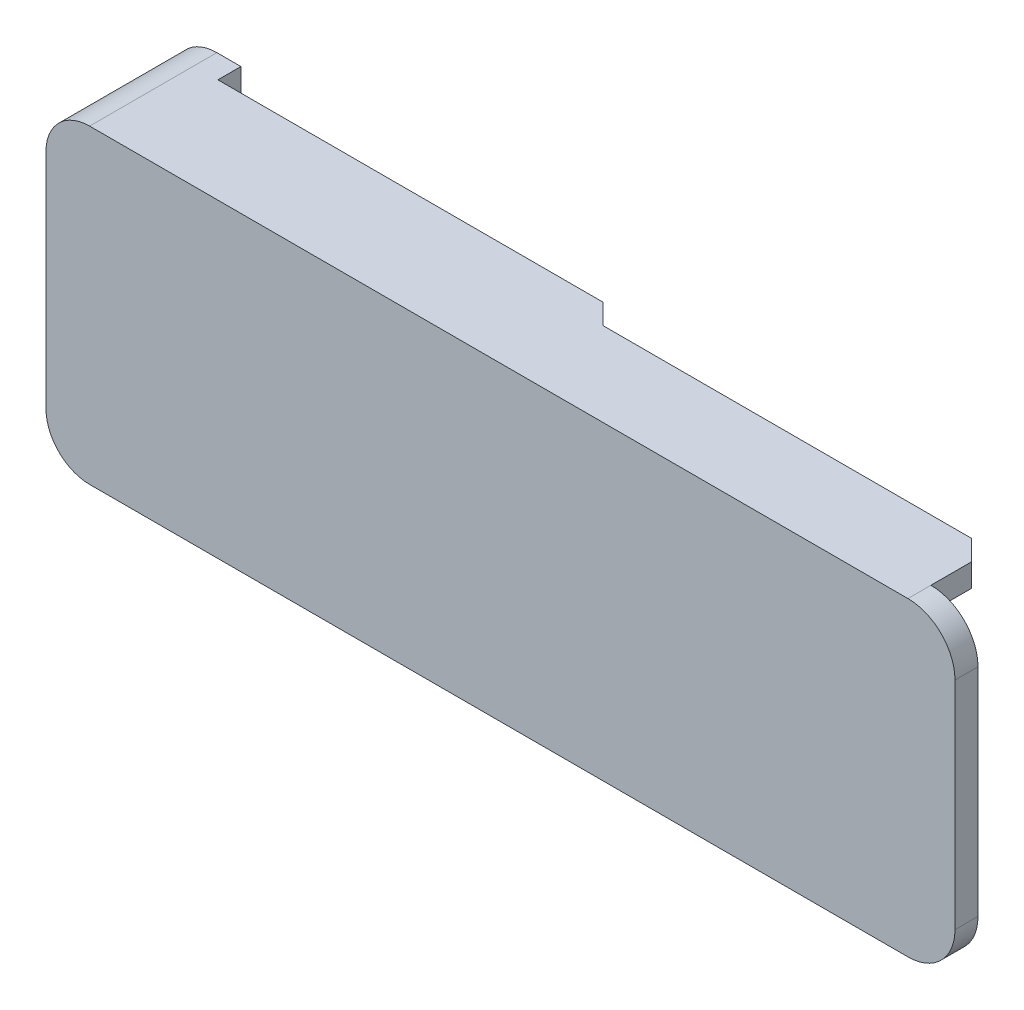
ISO-10303-21;
HEADER;
FILE_DESCRIPTION(('STEP AP214'),'2;1');
FILE_NAME('part.step','',(''),(''),'','','');
FILE_SCHEMA(('AUTOMOTIVE_DESIGN { 1 0 10303 214 1 1 1 1 }'));
ENDSEC;
DATA;
#1=APPLICATION_CONTEXT('core data for automotive mechanical design processes');
#2=APPLICATION_PROTOCOL_DEFINITION('international standard','automotive_design',2000,#1);
#3=PRODUCT_CONTEXT('',#1,'mechanical');
#4=PRODUCT('Part','Part','',(#3));
#5=PRODUCT_RELATED_PRODUCT_CATEGORY('part','',(#4));
#6=PRODUCT_DEFINITION_FORMATION('','',#4);
#7=PRODUCT_DEFINITION_CONTEXT('part definition',#1,'design');
#8=PRODUCT_DEFINITION('design','',#6,#7);
#9=PRODUCT_DEFINITION_SHAPE('','',#8);
#10=(LENGTH_UNIT() NAMED_UNIT(*) SI_UNIT(.MILLI.,.METRE.));
#11=(NAMED_UNIT(*) PLANE_ANGLE_UNIT() SI_UNIT($,.RADIAN.));
#12=(NAMED_UNIT(*) SI_UNIT($,.STERADIAN.) SOLID_ANGLE_UNIT());
#13=UNCERTAINTY_MEASURE_WITH_UNIT(LENGTH_MEASURE(1.E-05),#10,'distance_accuracy_value','');
#14=(GEOMETRIC_REPRESENTATION_CONTEXT(3) GLOBAL_UNCERTAINTY_ASSIGNED_CONTEXT((#13)) GLOBAL_UNIT_ASSIGNED_CONTEXT((#10,
#11,#12)) REPRESENTATION_CONTEXT('',''));
#15=CARTESIAN_POINT('',(0.,0.,0.));
#16=DIRECTION('',(0.,0.,1.));
#17=DIRECTION('',(1.,0.,0.));
#18=AXIS2_PLACEMENT_3D('',#15,#16,#17);
#19=CARTESIAN_POINT('',(-65.4990840744991,47.1076347781375,-6.));
#20=DIRECTION('',(0.,0.,1.));
#21=DIRECTION('',(1.,0.,0.));
#22=AXIS2_PLACEMENT_3D('',#19,#20,#21);
#23=PLANE('',#22);
#24=DIRECTION('',(0.,-1.,0.));
#25=VECTOR('',#24,1.);
#26=CARTESIAN_POINT('',(-63.7231673870083,27.4037181080197,-6.));
#27=LINE('',#26,#25);
#28=CARTESIAN_POINT('',(-63.7231673870083,50.3317180906467,-6.));
#29=VERTEX_POINT('',#28);
#30=CARTESIAN_POINT('',(-63.7231673870083,48.6317180906467,-6.));
#31=VERTEX_POINT('',#30);
#32=EDGE_CURVE('E222',#29,#31,#27,.T.);
#33=ORIENTED_EDGE('',*,*,#32,.F.);
#34=DIRECTION('',(-1.,0.,0.));
#35=VECTOR('',#34,1.);
#36=CARTESIAN_POINT('',(-5.04716840515152,50.3317180906467,-6.));
#37=LINE('',#36,#35);
#38=CARTESIAN_POINT('',(-35.2731262398253,50.3317180906467,-6.));
#39=VERTEX_POINT('',#38);
#40=EDGE_CURVE('E375',#39,#29,#37,.T.);
#41=ORIENTED_EDGE('',*,*,#40,.F.);
#42=DIRECTION('',(0.,1.,0.));
#43=VECTOR('',#42,1.);
#44=CARTESIAN_POINT('',(-35.2731262398253,21.3317180906467,-6.));
#45=LINE('',#44,#43);
#46=CARTESIAN_POINT('',(-35.2731262398253,48.6317180906467,-6.));
#47=VERTEX_POINT('',#46);
#48=EDGE_CURVE('E261',#47,#39,#45,.T.);
#49=ORIENTED_EDGE('',*,*,#48,.F.);
#50=DIRECTION('',(-1.,0.,0.));
#51=VECTOR('',#50,1.);
#52=CARTESIAN_POINT('',(-5.04716840515152,48.6317180906467,-6.));
#53=LINE('',#52,#51);
#54=EDGE_CURVE('E332',#47,#31,#53,.T.);
#55=ORIENTED_EDGE('',*,*,#54,.T.);
#56=EDGE_LOOP('',(#33,#41,#49,#55));
#57=FACE_BOUND('',#56,.T.);
#58=ADVANCED_FACE('F33',(#57),#23,.F.);
#59=CARTESIAN_POINT('',(-63.7231673870083,29.1037181080198,-6.));
#60=VERTEX_POINT('',#59);
#61=CARTESIAN_POINT('',(-63.7231673870083,27.4037181080197,-6.));
#62=VERTEX_POINT('',#61);
#63=EDGE_CURVE('E48',#60,#62,#27,.T.);
#64=ORIENTED_EDGE('',*,*,#63,.F.);
#65=DIRECTION('',(1.,0.,0.));
#66=VECTOR('',#65,1.);
#67=CARTESIAN_POINT('',(-14.8291687568263,29.1037181080198,-6.));
#68=LINE('',#67,#66);
#69=CARTESIAN_POINT('',(-35.2731262398253,29.1037181080198,-6.));
#70=VERTEX_POINT('',#69);
#71=EDGE_CURVE('E343',#60,#70,#68,.T.);
#72=ORIENTED_EDGE('',*,*,#71,.T.);
#73=CARTESIAN_POINT('',(-35.2731262398253,27.4037181080197,-6.));
#74=VERTEX_POINT('',#73);
#75=EDGE_CURVE('E278',#74,#70,#45,.T.);
#76=ORIENTED_EDGE('',*,*,#75,.F.);
#77=DIRECTION('',(1.,0.,0.));
#78=VECTOR('',#77,1.);
#79=CARTESIAN_POINT('',(-14.8291687568263,27.4037181080198,-6.));
#80=LINE('',#79,#78);
#81=EDGE_CURVE('E365',#62,#74,#80,.T.);
#82=ORIENTED_EDGE('',*,*,#81,.F.);
#83=EDGE_LOOP('',(#64,#72,#76,#82));
#84=FACE_BOUND('',#83,.T.);
#85=ADVANCED_FACE('F417',(#84),#23,.F.);
#86=CARTESIAN_POINT('',(-65.4990840744991,47.1076347781375,-6.));
#87=DIRECTION('',(0.,0.,1.));
#88=DIRECTION('',(1.,0.,0.));
#89=AXIS2_PLACEMENT_3D('',#86,#87,#88);
#90=CYLINDRICAL_SURFACE('',#89,3.22408331250919);
#91=DIRECTION('',(0.,0.,1.));
#92=VECTOR('',#91,1.);
#93=CARTESIAN_POINT('',(-68.7231673870083,47.1076347781375,-6.));
#94=LINE('',#93,#92);
#95=CARTESIAN_POINT('',(-68.7231673870083,47.1076347781375,-7.7));
#96=VERTEX_POINT('',#95);
#97=CARTESIAN_POINT('',(-68.7231673870083,47.1076347781375,1.7));
#98=VERTEX_POINT('',#97);
#99=EDGE_CURVE('E378',#96,#98,#94,.T.);
#100=ORIENTED_EDGE('',*,*,#99,.T.);
#101=CARTESIAN_POINT('',(-65.4990840744991,47.1076347781375,1.7));
#102=DIRECTION('',(0.,0.,1.));
#103=DIRECTION('',(1.,0.,0.));
#104=AXIS2_PLACEMENT_3D('',#101,#102,#103);
#105=CIRCLE('',#104,3.22408331250919);
#106=CARTESIAN_POINT('',(-65.4990840744991,50.3317180906467,1.7));
#107=VERTEX_POINT('',#106);
#108=EDGE_CURVE('E325',#107,#98,#105,.T.);
#109=ORIENTED_EDGE('',*,*,#108,.F.);
#110=DIRECTION('',(0.,0.,1.));
#111=VECTOR('',#110,1.);
#112=CARTESIAN_POINT('',(-65.4990840744991,50.3317180906467,-6.));
#113=LINE('',#112,#111);
#114=CARTESIAN_POINT('',(-65.4990840744991,50.3317180906467,-7.7));
#115=VERTEX_POINT('',#114);
#116=EDGE_CURVE('E379',#115,#107,#113,.T.);
#117=ORIENTED_EDGE('',*,*,#116,.F.);
#118=CARTESIAN_POINT('',(-65.4990840744991,47.1076347781375,-7.7));
#119=DIRECTION('',(0.,0.,-1.));
#120=DIRECTION('',(-1.,0.,0.));
#121=AXIS2_PLACEMENT_3D('',#118,#119,#120);
#122=CIRCLE('',#121,3.22408331250919);
#123=EDGE_CURVE('E232',#96,#115,#122,.T.);
#124=ORIENTED_EDGE('',*,*,#123,.F.);
#125=EDGE_LOOP('',(#100,#109,#117,#124));
#126=FACE_BOUND('',#125,.T.);
#127=ADVANCED_FACE('F35',(#126),#90,.T.);
#128=CARTESIAN_POINT('',(-65.4990840744991,50.3317180906467,-6.));
#129=DIRECTION('',(0.,1.,0.));
#130=DIRECTION('',(0.,0.,1.));
#131=AXIS2_PLACEMENT_3D('',#128,#129,#130);
#132=PLANE('',#131);
#133=DIRECTION('',(0.707106781186547,0.,0.707106781186548));
#134=VECTOR('',#133,1.);
#135=CARTESIAN_POINT('',(-6.54716840515152,50.3317180906467,-4.5));
#136=LINE('',#135,#134);
#137=CARTESIAN_POINT('',(-6.54716840515152,50.3317180906467,-4.5));
#138=VERTEX_POINT('',#137);
#139=CARTESIAN_POINT('',(-5.04716840515152,50.3317180906467,-3.));
#140=VERTEX_POINT('',#139);
#141=EDGE_CURVE('E255',#138,#140,#136,.T.);
#142=ORIENTED_EDGE('',*,*,#141,.F.);
#143=DIRECTION('',(1.,0.,0.));
#144=VECTOR('',#143,1.);
#145=CARTESIAN_POINT('',(-33.7731262398253,50.3317180906467,-4.5));
#146=LINE('',#145,#144);
#147=CARTESIAN_POINT('',(-33.7731262398253,50.3317180906467,-4.5));
#148=VERTEX_POINT('',#147);
#149=EDGE_CURVE('E252',#148,#138,#146,.T.);
#150=ORIENTED_EDGE('',*,*,#149,.F.);
#151=DIRECTION('',(0.707106781186546,0.,0.707106781186549));
#152=VECTOR('',#151,1.);
#153=CARTESIAN_POINT('',(-35.2731262398253,50.3317180906467,-6.));
#154=LINE('',#153,#152);
#155=EDGE_CURVE('E249',#39,#148,#154,.T.);
#156=ORIENTED_EDGE('',*,*,#155,.F.);
#157=ORIENTED_EDGE('',*,*,#40,.T.);
#158=DIRECTION('',(0.,0.,1.));
#159=VECTOR('',#158,1.);
#160=CARTESIAN_POINT('',(-63.7231673870083,50.3317180906467,-7.7));
#161=LINE('',#160,#159);
#162=CARTESIAN_POINT('',(-63.7231673870083,50.3317180906467,-7.7));
#163=VERTEX_POINT('',#162);
#164=EDGE_CURVE('E240',#163,#29,#161,.T.);
#165=ORIENTED_EDGE('',*,*,#164,.F.);
#166=DIRECTION('',(1.,0.,0.));
#167=VECTOR('',#166,1.);
#168=CARTESIAN_POINT('',(-65.4990840744991,50.3317180906467,-7.7));
#169=LINE('',#168,#167);
#170=EDGE_CURVE('E235',#115,#163,#169,.T.);
#171=ORIENTED_EDGE('',*,*,#170,.F.);
#172=ORIENTED_EDGE('',*,*,#116,.T.);
#173=DIRECTION('',(-1.,0.,0.));
#174=VECTOR('',#173,1.);
#175=CARTESIAN_POINT('',(-5.04716840515152,50.3317180906467,1.7));
#176=LINE('',#175,#174);
#177=CARTESIAN_POINT('',(-5.04716840515152,50.3317180906467,1.7));
#178=VERTEX_POINT('',#177);
#179=EDGE_CURVE('E322',#178,#107,#176,.T.);
#180=ORIENTED_EDGE('',*,*,#179,.F.);
#181=DIRECTION('',(0.,0.,1.));
#182=VECTOR('',#181,1.);
#183=CARTESIAN_POINT('',(-5.04716840515152,50.3317180906467,-6.));
#184=LINE('',#183,#182);
#185=CARTESIAN_POINT('',(-5.04716840515152,50.3317180906467,0.));
#186=VERTEX_POINT('',#185);
#187=EDGE_CURVE('E382',#186,#178,#184,.T.);
#188=ORIENTED_EDGE('',*,*,#187,.F.);
#189=DIRECTION('',(0.,0.,1.));
#190=VECTOR('',#189,1.);
#191=CARTESIAN_POINT('',(-5.04716840515152,50.3317180906467,-3.));
#192=LINE('',#191,#190);
#193=EDGE_CURVE('E258',#140,#186,#192,.T.);
#194=ORIENTED_EDGE('',*,*,#193,.F.);
#195=EDGE_LOOP('',(#142,#150,#156,#157,#165,#171,#172,#180,#188,#194));
#196=FACE_BOUND('',#195,.T.);
#197=ADVANCED_FACE('F428',(#196),#132,.T.);
#198=CARTESIAN_POINT('',(-5.04716840515152,46.8537180906467,-6.));
#199=DIRECTION('',(0.,0.,1.));
#200=DIRECTION('',(1.,0.,0.));
#201=AXIS2_PLACEMENT_3D('',#198,#199,#200);
#202=CYLINDRICAL_SURFACE('',#201,3.478);
#203=CARTESIAN_POINT('',(-5.04716840515152,46.8537180906467,0.));
#204=DIRECTION('',(0.,0.,1.));
#205=DIRECTION('',(1.,0.,0.));
#206=AXIS2_PLACEMENT_3D('',#203,#204,#205);
#207=CIRCLE('',#206,3.478);
#208=CARTESIAN_POINT('',(-1.56916840515152,46.8537180906467,0.));
#209=VERTEX_POINT('',#208);
#210=EDGE_CURVE('E289',#186,#209,#207,.F.);
#211=ORIENTED_EDGE('',*,*,#210,.F.);
#212=ORIENTED_EDGE('',*,*,#187,.T.);
#213=CARTESIAN_POINT('',(-5.04716840515152,46.8537180906467,1.7));
#214=DIRECTION('',(0.,0.,1.));
#215=DIRECTION('',(1.,0.,0.));
#216=AXIS2_PLACEMENT_3D('',#213,#214,#215);
#217=CIRCLE('',#216,3.478);
#218=CARTESIAN_POINT('',(-1.56916840515152,46.8537180906467,1.7));
#219=VERTEX_POINT('',#218);
#220=EDGE_CURVE('E319',#219,#178,#217,.T.);
#221=ORIENTED_EDGE('',*,*,#220,.F.);
#222=DIRECTION('',(0.,0.,1.));
#223=VECTOR('',#222,1.);
#224=CARTESIAN_POINT('',(-1.56916840515152,46.8537180906467,-6.));
#225=LINE('',#224,#223);
#226=EDGE_CURVE('E384',#209,#219,#225,.T.);
#227=ORIENTED_EDGE('',*,*,#226,.F.);
#228=EDGE_LOOP('',(#211,#212,#221,#227));
#229=FACE_BOUND('',#228,.T.);
#230=ADVANCED_FACE('F484',(#229),#202,.T.);
#231=CARTESIAN_POINT('',(-1.56916840515152,43.9657183857165,-6.));
#232=DIRECTION('',(1.,0.,0.));
#233=DIRECTION('',(0.,1.,0.));
#234=AXIS2_PLACEMENT_3D('',#231,#232,#233);
#235=PLANE('',#234);
#236=DIRECTION('',(0.,1.,0.));
#237=VECTOR('',#236,1.);
#238=CARTESIAN_POINT('',(-1.56916840515152,21.3317180906467,0.));
#239=LINE('',#238,#237);
#240=CARTESIAN_POINT('',(-1.56916840515152,30.8817181080198,0.));
#241=VERTEX_POINT('',#240);
#242=EDGE_CURVE('E262',#241,#209,#239,.T.);
#243=ORIENTED_EDGE('',*,*,#242,.T.);
#244=ORIENTED_EDGE('',*,*,#226,.T.);
#245=DIRECTION('',(0.,1.,0.));
#246=VECTOR('',#245,1.);
#247=CARTESIAN_POINT('',(-1.56916840515152,30.8817181080198,1.7));
#248=LINE('',#247,#246);
#249=CARTESIAN_POINT('',(-1.56916840515152,30.8817181080198,1.7));
#250=VERTEX_POINT('',#249);
#251=EDGE_CURVE('E316',#250,#219,#248,.T.);
#252=ORIENTED_EDGE('',*,*,#251,.F.);
#253=DIRECTION('',(0.,0.,1.));
#254=VECTOR('',#253,1.);
#255=CARTESIAN_POINT('',(-1.56916840515152,30.8817181080198,-6.));
#256=LINE('',#255,#254);
#257=EDGE_CURVE('E386',#241,#250,#256,.T.);
#258=ORIENTED_EDGE('',*,*,#257,.F.);
#259=EDGE_LOOP('',(#243,#244,#252,#258));
#260=FACE_BOUND('',#259,.T.);
#261=ADVANCED_FACE('F478',(#260),#235,.T.);
#262=CARTESIAN_POINT('',(-5.04716840515152,30.8817181080198,-6.));
#263=DIRECTION('',(0.,0.,1.));
#264=DIRECTION('',(1.,0.,0.));
#265=AXIS2_PLACEMENT_3D('',#262,#263,#264);
#266=CYLINDRICAL_SURFACE('',#265,3.478);
#267=CARTESIAN_POINT('',(-5.04716840515152,30.8817181080198,0.));
#268=DIRECTION('',(0.,0.,1.));
#269=DIRECTION('',(1.,0.,0.));
#270=AXIS2_PLACEMENT_3D('',#267,#268,#269);
#271=CIRCLE('',#270,3.478);
#272=CARTESIAN_POINT('',(-5.04716840515152,27.4037181080198,0.));
#273=VERTEX_POINT('',#272);
#274=EDGE_CURVE('E287',#241,#273,#271,.F.);
#275=ORIENTED_EDGE('',*,*,#274,.F.);
#276=ORIENTED_EDGE('',*,*,#257,.T.);
#277=CARTESIAN_POINT('',(-5.04716840515152,30.8817181080198,1.7));
#278=DIRECTION('',(0.,0.,1.));
#279=DIRECTION('',(1.,0.,0.));
#280=AXIS2_PLACEMENT_3D('',#277,#278,#279);
#281=CIRCLE('',#280,3.478);
#282=CARTESIAN_POINT('',(-5.04716840515157,27.4037181080198,1.7));
#283=VERTEX_POINT('',#282);
#284=EDGE_CURVE('E313',#283,#250,#281,.T.);
#285=ORIENTED_EDGE('',*,*,#284,.F.);
#286=DIRECTION('',(0.,0.,1.));
#287=VECTOR('',#286,1.);
#288=CARTESIAN_POINT('',(-5.04716840515157,27.4037181080198,-6.));
#289=LINE('',#288,#287);
#290=EDGE_CURVE('E207',#273,#283,#289,.T.);
#291=ORIENTED_EDGE('',*,*,#290,.F.);
#292=EDGE_LOOP('',(#275,#276,#285,#291));
#293=FACE_BOUND('',#292,.T.);
#294=ADVANCED_FACE('F475',(#293),#266,.T.);
#295=CARTESIAN_POINT('',(-5.04716840515157,27.4037181080198,-6.));
#296=DIRECTION('',(0.,-1.,0.));
#297=DIRECTION('',(0.,0.,-1.));
#298=AXIS2_PLACEMENT_3D('',#295,#296,#297);
#299=PLANE('',#298);
#300=DIRECTION('',(-0.707106781186547,0.,-0.707106781186548));
#301=VECTOR('',#300,1.);
#302=CARTESIAN_POINT('',(-6.54716840515155,27.4037181080198,-4.50000000000003));
#303=LINE('',#302,#301);
#304=CARTESIAN_POINT('',(-5.04716840515152,27.4037181080198,-3.));
#305=VERTEX_POINT('',#304);
#306=CARTESIAN_POINT('',(-6.54716840515152,27.4037181080198,-4.5));
#307=VERTEX_POINT('',#306);
#308=EDGE_CURVE('E297',#305,#307,#303,.T.);
#309=ORIENTED_EDGE('',*,*,#308,.F.);
#310=DIRECTION('',(0.,0.,-1.));
#311=VECTOR('',#310,1.);
#312=CARTESIAN_POINT('',(-5.04716840515157,27.4037181080198,-6.));
#313=LINE('',#312,#311);
#314=EDGE_CURVE('E285',#273,#305,#313,.T.);
#315=ORIENTED_EDGE('',*,*,#314,.F.);
#316=ORIENTED_EDGE('',*,*,#290,.T.);
#317=DIRECTION('',(1.,0.,0.));
#318=VECTOR('',#317,1.);
#319=CARTESIAN_POINT('',(-65.4990836673539,27.4037181080197,1.7));
#320=LINE('',#319,#318);
#321=CARTESIAN_POINT('',(-65.4990836673539,27.4037181080197,1.7));
#322=VERTEX_POINT('',#321);
#323=EDGE_CURVE('E203',#322,#283,#320,.T.);
#324=ORIENTED_EDGE('',*,*,#323,.F.);
#325=DIRECTION('',(0.,0.,1.));
#326=VECTOR('',#325,1.);
#327=CARTESIAN_POINT('',(-65.4990836673539,27.4037181080197,-6.));
#328=LINE('',#327,#326);
#329=CARTESIAN_POINT('',(-65.4990836673539,27.4037181080198,-7.7));
#330=VERTEX_POINT('',#329);
#331=EDGE_CURVE('E195',#330,#322,#328,.T.);
#332=ORIENTED_EDGE('',*,*,#331,.F.);
#333=DIRECTION('',(-1.,0.,0.));
#334=VECTOR('',#333,1.);
#335=CARTESIAN_POINT('',(-65.4990836673539,27.4037181080197,-7.7));
#336=LINE('',#335,#334);
#337=CARTESIAN_POINT('',(-63.7231673870083,27.4037181080197,-7.7));
#338=VERTEX_POINT('',#337);
#339=EDGE_CURVE('E201',#338,#330,#336,.T.);
#340=ORIENTED_EDGE('',*,*,#339,.F.);
#341=DIRECTION('',(0.,0.,1.));
#342=VECTOR('',#341,1.);
#343=CARTESIAN_POINT('',(-63.7231673870083,27.4037181080197,-7.7));
#344=LINE('',#343,#342);
#345=EDGE_CURVE('E237',#338,#62,#344,.T.);
#346=ORIENTED_EDGE('',*,*,#345,.T.);
#347=ORIENTED_EDGE('',*,*,#81,.T.);
#348=DIRECTION('',(-0.707106781186546,0.,-0.707106781186549));
#349=VECTOR('',#348,1.);
#350=CARTESIAN_POINT('',(-20.1601473224885,27.4037181080198,9.11297891733688));
#351=LINE('',#350,#349);
#352=CARTESIAN_POINT('',(-33.7731262398253,27.4037181080198,-4.5));
#353=VERTEX_POINT('',#352);
#354=EDGE_CURVE('E302',#353,#74,#351,.T.);
#355=ORIENTED_EDGE('',*,*,#354,.F.);
#356=DIRECTION('',(-1.,0.,0.));
#357=VECTOR('',#356,1.);
#358=CARTESIAN_POINT('',(-5.04716840515157,27.4037181080198,-4.5));
#359=LINE('',#358,#357);
#360=EDGE_CURVE('E308',#307,#353,#359,.T.);
#361=ORIENTED_EDGE('',*,*,#360,.F.);
#362=EDGE_LOOP('',(#309,#315,#316,#324,#332,#340,#346,#347,#355,#361));
#363=FACE_BOUND('',#362,.T.);
#364=ADVANCED_FACE('F198',(#363),#299,.T.);
#365=CARTESIAN_POINT('',(-65.4990836673539,30.6278018276743,-6.));
#366=DIRECTION('',(0.,0.,1.));
#367=DIRECTION('',(1.,0.,0.));
#368=AXIS2_PLACEMENT_3D('',#365,#366,#367);
#369=CYLINDRICAL_SURFACE('',#368,3.22408371965449);
#370=ORIENTED_EDGE('',*,*,#331,.T.);
#371=CARTESIAN_POINT('',(-65.4990836673539,30.6278018276743,1.7));
#372=DIRECTION('',(0.,0.,1.));
#373=DIRECTION('',(1.,0.,0.));
#374=AXIS2_PLACEMENT_3D('',#371,#372,#373);
#375=CIRCLE('',#374,3.2240837196545);
#376=CARTESIAN_POINT('',(-68.7231673870083,30.6278018276743,1.7));
#377=VERTEX_POINT('',#376);
#378=EDGE_CURVE('E310',#377,#322,#375,.T.);
#379=ORIENTED_EDGE('',*,*,#378,.F.);
#380=DIRECTION('',(0.,0.,1.));
#381=VECTOR('',#380,1.);
#382=CARTESIAN_POINT('',(-68.7231673870083,30.6278018276743,-6.));
#383=LINE('',#382,#381);
#384=CARTESIAN_POINT('',(-68.7231673870083,30.6278018276743,-7.7));
#385=VERTEX_POINT('',#384);
#386=EDGE_CURVE('E208',#385,#377,#383,.T.);
#387=ORIENTED_EDGE('',*,*,#386,.F.);
#388=CARTESIAN_POINT('',(-65.4990836673539,30.6278018276743,-7.7));
#389=DIRECTION('',(0.,0.,-1.));
#390=DIRECTION('',(-1.,0.,0.));
#391=AXIS2_PLACEMENT_3D('',#388,#389,#390);
#392=CIRCLE('',#391,3.2240837196545);
#393=EDGE_CURVE('E211',#330,#385,#392,.T.);
#394=ORIENTED_EDGE('',*,*,#393,.F.);
#395=EDGE_LOOP('',(#370,#379,#387,#394));
#396=FACE_BOUND('',#395,.T.);
#397=ADVANCED_FACE('F212',(#396),#369,.T.);
#398=CARTESIAN_POINT('',(-68.7231673870083,30.6278018276743,-6.));
#399=DIRECTION('',(-1.,0.,0.));
#400=DIRECTION('',(0.,0.,1.));
#401=AXIS2_PLACEMENT_3D('',#398,#399,#400);
#402=PLANE('',#401);
#403=CARTESIAN_POINT('',(-68.7231673870083,41.1079776247645,-2.34175307204268));
#404=DIRECTION('',(-1.,0.,0.));
#405=DIRECTION('',(0.,0.,1.));
#406=AXIS2_PLACEMENT_3D('',#403,#404,#405);
#407=CIRCLE('',#406,1.075);
#408=CARTESIAN_POINT('',(-68.7231673870083,41.1079776247645,-1.26675307204268));
#409=VERTEX_POINT('',#408);
#410=EDGE_CURVE('E400',#409,#409,#407,.T.);
#411=ORIENTED_EDGE('',*,*,#410,.F.);
#412=EDGE_LOOP('',(#411));
#413=FACE_BOUND('',#412,.T.);
#414=CARTESIAN_POINT('',(-68.7231673870083,36.6433802657663,-2.34175307204268));
#415=DIRECTION('',(-1.,0.,0.));
#416=DIRECTION('',(0.,0.,1.));
#417=AXIS2_PLACEMENT_3D('',#414,#415,#416);
#418=CIRCLE('',#417,1.075);
#419=CARTESIAN_POINT('',(-68.7231673870083,36.6433802657663,-1.26675307204268));
#420=VERTEX_POINT('',#419);
#421=EDGE_CURVE('E228',#420,#420,#418,.T.);
#422=ORIENTED_EDGE('',*,*,#421,.F.);
#423=EDGE_LOOP('',(#422));
#424=FACE_BOUND('',#423,.T.);
#425=ORIENTED_EDGE('',*,*,#386,.T.);
#426=DIRECTION('',(0.,-1.,0.));
#427=VECTOR('',#426,1.);
#428=CARTESIAN_POINT('',(-68.7231673870083,47.1076347781375,1.7));
#429=LINE('',#428,#427);
#430=EDGE_CURVE('E328',#98,#377,#429,.T.);
#431=ORIENTED_EDGE('',*,*,#430,.F.);
#432=ORIENTED_EDGE('',*,*,#99,.F.);
#433=DIRECTION('',(0.,1.,0.));
#434=VECTOR('',#433,1.);
#435=CARTESIAN_POINT('',(-68.7231673870083,47.1076347781375,-7.7));
#436=LINE('',#435,#434);
#437=EDGE_CURVE('E216',#385,#96,#436,.T.);
#438=ORIENTED_EDGE('',*,*,#437,.F.);
#439=EDGE_LOOP('',(#425,#431,#432,#438));
#440=FACE_BOUND('',#439,.T.);
#441=ADVANCED_FACE('F491',(#413,#424,#440),#402,.T.);
#442=CARTESIAN_POINT('',(-5.04716840515153,29.1037181080198,-6.));
#443=DIRECTION('',(0.,-1.,0.));
#444=DIRECTION('',(0.,0.,-1.));
#445=AXIS2_PLACEMENT_3D('',#442,#443,#444);
#446=PLANE('',#445);
#447=CARTESIAN_POINT('',(-8.54716840515152,29.1037181080198,-2.25));
#448=DIRECTION('',(0.,-1.,0.));
#449=DIRECTION('',(0.,0.,-1.));
#450=AXIS2_PLACEMENT_3D('',#447,#448,#449);
#451=CIRCLE('',#450,1.);
#452=CARTESIAN_POINT('',(-8.54716840515152,29.1037181080198,-3.25));
#453=VERTEX_POINT('',#452);
#454=EDGE_CURVE('E246',#453,#453,#451,.T.);
#455=ORIENTED_EDGE('',*,*,#454,.T.);
#456=EDGE_LOOP('',(#455));
#457=FACE_BOUND('',#456,.T.);
#458=DIRECTION('',(0.,0.,-1.));
#459=VECTOR('',#458,1.);
#460=CARTESIAN_POINT('',(-5.04716840515153,29.1037181080198,-6.));
#461=LINE('',#460,#459);
#462=CARTESIAN_POINT('',(-5.04716840515152,29.1037181080198,0.));
#463=VERTEX_POINT('',#462);
#464=CARTESIAN_POINT('',(-5.04716840515152,29.1037181080198,-3.));
#465=VERTEX_POINT('',#464);
#466=EDGE_CURVE('E282',#463,#465,#461,.T.);
#467=ORIENTED_EDGE('',*,*,#466,.T.);
#468=DIRECTION('',(-0.707106781186547,0.,-0.707106781186548));
#469=VECTOR('',#468,1.);
#470=CARTESIAN_POINT('',(-6.54716840515153,29.1037181080198,-4.50000000000001));
#471=LINE('',#470,#469);
#472=CARTESIAN_POINT('',(-6.54716840515152,29.1037181080198,-4.5));
#473=VERTEX_POINT('',#472);
#474=EDGE_CURVE('E294',#465,#473,#471,.T.);
#475=ORIENTED_EDGE('',*,*,#474,.T.);
#476=DIRECTION('',(-1.,0.,0.));
#477=VECTOR('',#476,1.);
#478=CARTESIAN_POINT('',(-5.04716840515153,29.1037181080198,-4.5));
#479=LINE('',#478,#477);
#480=CARTESIAN_POINT('',(-33.7731262398253,29.1037181080198,-4.5));
#481=VERTEX_POINT('',#480);
#482=EDGE_CURVE('E305',#473,#481,#479,.T.);
#483=ORIENTED_EDGE('',*,*,#482,.T.);
#484=DIRECTION('',(-0.707106781186546,0.,-0.707106781186549));
#485=VECTOR('',#484,1.);
#486=CARTESIAN_POINT('',(-20.1601473224885,29.1037181080198,9.1129789173369));
#487=LINE('',#486,#485);
#488=EDGE_CURVE('E299',#481,#70,#487,.T.);
#489=ORIENTED_EDGE('',*,*,#488,.T.);
#490=ORIENTED_EDGE('',*,*,#71,.F.);
#491=CARTESIAN_POINT('',(-65.4990836673539,29.1037181080198,-6.));
#492=VERTEX_POINT('',#491);
#493=EDGE_CURVE('E344',#492,#60,#68,.T.);
#494=ORIENTED_EDGE('',*,*,#493,.F.);
#495=DIRECTION('',(0.,0.,1.));
#496=VECTOR('',#495,1.);
#497=CARTESIAN_POINT('',(-65.4990836673539,29.1037181080198,-6.));
#498=LINE('',#497,#496);
#499=CARTESIAN_POINT('',(-65.4990836673539,29.1037181080198,0.));
#500=VERTEX_POINT('',#499);
#501=EDGE_CURVE('E362',#492,#500,#498,.T.);
#502=ORIENTED_EDGE('',*,*,#501,.T.);
#503=DIRECTION('',(1.,0.,0.));
#504=VECTOR('',#503,1.);
#505=CARTESIAN_POINT('',(-5.04716840515153,29.1037181080198,0.));
#506=LINE('',#505,#504);
#507=EDGE_CURVE('E359',#500,#463,#506,.T.);
#508=ORIENTED_EDGE('',*,*,#507,.T.);
#509=EDGE_LOOP('',(#467,#475,#483,#489,#490,#494,#502,#508));
#510=FACE_BOUND('',#509,.T.);
#511=ADVANCED_FACE('F414',(#457,#510),#446,.F.);
#512=CARTESIAN_POINT('',(-65.4990836673539,30.6278018276743,-6.));
#513=DIRECTION('',(0.,0.,1.));
#514=DIRECTION('',(1.,0.,0.));
#515=AXIS2_PLACEMENT_3D('',#512,#513,#514);
#516=CYLINDRICAL_SURFACE('',#515,1.52408371965449);
#517=CARTESIAN_POINT('',(-65.4990836673539,30.6278018276743,0.));
#518=DIRECTION('',(0.,0.,1.));
#519=DIRECTION('',(1.,0.,0.));
#520=AXIS2_PLACEMENT_3D('',#517,#518,#519);
#521=CIRCLE('',#520,1.52408371965449);
#522=CARTESIAN_POINT('',(-67.0231673870083,30.6278018276743,0.));
#523=VERTEX_POINT('',#522);
#524=EDGE_CURVE('E356',#523,#500,#521,.T.);
#525=ORIENTED_EDGE('',*,*,#524,.T.);
#526=ORIENTED_EDGE('',*,*,#501,.F.);
#527=CARTESIAN_POINT('',(-65.4990836673539,30.6278018276743,-6.));
#528=DIRECTION('',(0.,0.,1.));
#529=DIRECTION('',(1.,0.,0.));
#530=AXIS2_PLACEMENT_3D('',#527,#528,#529);
#531=CIRCLE('',#530,1.52408371965449);
#532=CARTESIAN_POINT('',(-67.0231673870083,30.6278018276743,-6.));
#533=VERTEX_POINT('',#532);
#534=EDGE_CURVE('E340',#533,#492,#531,.T.);
#535=ORIENTED_EDGE('',*,*,#534,.F.);
#536=DIRECTION('',(0.,0.,1.));
#537=VECTOR('',#536,1.);
#538=CARTESIAN_POINT('',(-67.0231673870083,30.6278018276743,-6.));
#539=LINE('',#538,#537);
#540=EDGE_CURVE('E366',#533,#523,#539,.T.);
#541=ORIENTED_EDGE('',*,*,#540,.T.);
#542=EDGE_LOOP('',(#525,#526,#535,#541));
#543=FACE_BOUND('',#542,.T.);
#544=ADVANCED_FACE('F456',(#543),#516,.F.);
#545=CARTESIAN_POINT('',(-67.0231673870083,30.6278018276743,-6.));
#546=DIRECTION('',(-1.,0.,0.));
#547=DIRECTION('',(0.,0.,1.));
#548=AXIS2_PLACEMENT_3D('',#545,#546,#547);
#549=PLANE('',#548);
#550=CARTESIAN_POINT('',(-67.0231673870083,41.1079776247645,-2.34175307204268));
#551=DIRECTION('',(-1.,0.,0.));
#552=DIRECTION('',(0.,0.,1.));
#553=AXIS2_PLACEMENT_3D('',#550,#551,#552);
#554=CIRCLE('',#553,1.075);
#555=CARTESIAN_POINT('',(-67.0231673870083,41.1079776247645,-1.26675307204268));
#556=VERTEX_POINT('',#555);
#557=EDGE_CURVE('E399',#556,#556,#554,.T.);
#558=ORIENTED_EDGE('',*,*,#557,.T.);
#559=EDGE_LOOP('',(#558));
#560=FACE_BOUND('',#559,.T.);
#561=CARTESIAN_POINT('',(-67.0231673870083,36.6433802657663,-2.34175307204268));
#562=DIRECTION('',(-1.,0.,0.));
#563=DIRECTION('',(0.,0.,1.));
#564=AXIS2_PLACEMENT_3D('',#561,#562,#563);
#565=CIRCLE('',#564,1.075);
#566=CARTESIAN_POINT('',(-67.0231673870083,36.6433802657663,-1.26675307204268));
#567=VERTEX_POINT('',#566);
#568=EDGE_CURVE('E396',#567,#567,#565,.T.);
#569=ORIENTED_EDGE('',*,*,#568,.T.);
#570=EDGE_LOOP('',(#569));
#571=FACE_BOUND('',#570,.T.);
#572=DIRECTION('',(0.,-1.,0.));
#573=VECTOR('',#572,1.);
#574=CARTESIAN_POINT('',(-67.0231673870083,30.6278018276743,0.));
#575=LINE('',#574,#573);
#576=CARTESIAN_POINT('',(-67.0231673870083,47.1076347781375,0.));
#577=VERTEX_POINT('',#576);
#578=EDGE_CURVE('E353',#577,#523,#575,.T.);
#579=ORIENTED_EDGE('',*,*,#578,.T.);
#580=ORIENTED_EDGE('',*,*,#540,.F.);
#581=DIRECTION('',(0.,-1.,0.));
#582=VECTOR('',#581,1.);
#583=CARTESIAN_POINT('',(-67.0231673870083,30.6278018276743,-6.));
#584=LINE('',#583,#582);
#585=CARTESIAN_POINT('',(-67.0231673870083,47.1076347781375,-6.));
#586=VERTEX_POINT('',#585);
#587=EDGE_CURVE('E337',#586,#533,#584,.T.);
#588=ORIENTED_EDGE('',*,*,#587,.F.);
#589=DIRECTION('',(0.,0.,1.));
#590=VECTOR('',#589,1.);
#591=CARTESIAN_POINT('',(-67.0231673870083,47.1076347781375,-6.));
#592=LINE('',#591,#590);
#593=EDGE_CURVE('E369',#586,#577,#592,.T.);
#594=ORIENTED_EDGE('',*,*,#593,.T.);
#595=EDGE_LOOP('',(#579,#580,#588,#594));
#596=FACE_BOUND('',#595,.T.);
#597=ADVANCED_FACE('F454',(#560,#571,#596),#549,.F.);
#598=CARTESIAN_POINT('',(-65.4990840744991,47.1076347781375,-6.));
#599=DIRECTION('',(0.,0.,1.));
#600=DIRECTION('',(1.,0.,0.));
#601=AXIS2_PLACEMENT_3D('',#598,#599,#600);
#602=CYLINDRICAL_SURFACE('',#601,1.52408331250919);
#603=CARTESIAN_POINT('',(-65.4990840744991,47.1076347781375,0.));
#604=DIRECTION('',(0.,0.,1.));
#605=DIRECTION('',(1.,0.,0.));
#606=AXIS2_PLACEMENT_3D('',#603,#604,#605);
#607=CIRCLE('',#606,1.52408331250919);
#608=CARTESIAN_POINT('',(-65.4990840744991,48.6317180906467,0.));
#609=VERTEX_POINT('',#608);
#610=EDGE_CURVE('E350',#609,#577,#607,.T.);
#611=ORIENTED_EDGE('',*,*,#610,.T.);
#612=ORIENTED_EDGE('',*,*,#593,.F.);
#613=CARTESIAN_POINT('',(-65.4990840744991,47.1076347781375,-6.));
#614=DIRECTION('',(0.,0.,1.));
#615=DIRECTION('',(1.,0.,0.));
#616=AXIS2_PLACEMENT_3D('',#613,#614,#615);
#617=CIRCLE('',#616,1.52408331250919);
#618=CARTESIAN_POINT('',(-65.4990840744991,48.6317180906467,-6.));
#619=VERTEX_POINT('',#618);
#620=EDGE_CURVE('E334',#619,#586,#617,.T.);
#621=ORIENTED_EDGE('',*,*,#620,.F.);
#622=DIRECTION('',(0.,0.,1.));
#623=VECTOR('',#622,1.);
#624=CARTESIAN_POINT('',(-65.4990840744991,48.6317180906467,-6.));
#625=LINE('',#624,#623);
#626=EDGE_CURVE('E347',#619,#609,#625,.T.);
#627=ORIENTED_EDGE('',*,*,#626,.T.);
#628=EDGE_LOOP('',(#611,#612,#621,#627));
#629=FACE_BOUND('',#628,.T.);
#630=ADVANCED_FACE('F451',(#629),#602,.F.);
#631=CARTESIAN_POINT('',(-65.4990840744991,48.6317180906467,-6.));
#632=DIRECTION('',(0.,1.,0.));
#633=DIRECTION('',(0.,0.,1.));
#634=AXIS2_PLACEMENT_3D('',#631,#632,#633);
#635=PLANE('',#634);
#636=CARTESIAN_POINT('',(-8.54716840515152,48.6317180906467,-2.25));
#637=DIRECTION('',(0.,-1.,0.));
#638=DIRECTION('',(0.,0.,-1.));
#639=AXIS2_PLACEMENT_3D('',#636,#637,#638);
#640=CIRCLE('',#639,1.);
#641=CARTESIAN_POINT('',(-8.54716840515152,48.6317180906467,-3.25));
#642=VERTEX_POINT('',#641);
#643=EDGE_CURVE('E243',#642,#642,#640,.T.);
#644=ORIENTED_EDGE('',*,*,#643,.F.);
#645=EDGE_LOOP('',(#644));
#646=FACE_BOUND('',#645,.T.);
#647=DIRECTION('',(1.,0.,0.));
#648=VECTOR('',#647,1.);
#649=CARTESIAN_POINT('',(-65.4990840744991,48.6317180906467,-4.5));
#650=LINE('',#649,#648);
#651=CARTESIAN_POINT('',(-33.7731262398253,48.6317180906467,-4.5));
#652=VERTEX_POINT('',#651);
#653=CARTESIAN_POINT('',(-6.54716840515152,48.6317180906467,-4.5));
#654=VERTEX_POINT('',#653);
#655=EDGE_CURVE('E393',#652,#654,#650,.T.);
#656=ORIENTED_EDGE('',*,*,#655,.T.);
#657=DIRECTION('',(0.707106781186547,0.,0.707106781186548));
#658=VECTOR('',#657,1.);
#659=CARTESIAN_POINT('',(-36.7731262398253,48.6317180906467,-34.7259578346738));
#660=LINE('',#659,#658);
#661=CARTESIAN_POINT('',(-5.04716840515152,48.6317180906467,-3.));
#662=VERTEX_POINT('',#661);
#663=EDGE_CURVE('E291',#654,#662,#660,.T.);
#664=ORIENTED_EDGE('',*,*,#663,.T.);
#665=DIRECTION('',(0.,0.,1.));
#666=VECTOR('',#665,1.);
#667=CARTESIAN_POINT('',(-5.04716840515152,48.6317180906467,-6.));
#668=LINE('',#667,#666);
#669=CARTESIAN_POINT('',(-5.04716840515152,48.6317180906467,0.));
#670=VERTEX_POINT('',#669);
#671=EDGE_CURVE('E265',#662,#670,#668,.T.);
#672=ORIENTED_EDGE('',*,*,#671,.T.);
#673=DIRECTION('',(-1.,0.,0.));
#674=VECTOR('',#673,1.);
#675=CARTESIAN_POINT('',(-65.4990840744991,48.6317180906467,0.));
#676=LINE('',#675,#674);
#677=EDGE_CURVE('E331',#670,#609,#676,.T.);
#678=ORIENTED_EDGE('',*,*,#677,.T.);
#679=ORIENTED_EDGE('',*,*,#626,.F.);
#680=EDGE_CURVE('E56',#31,#619,#53,.T.);
#681=ORIENTED_EDGE('',*,*,#680,.F.);
#682=ORIENTED_EDGE('',*,*,#54,.F.);
#683=DIRECTION('',(0.707106781186546,0.,0.707106781186549));
#684=VECTOR('',#683,1.);
#685=CARTESIAN_POINT('',(-50.3861051571622,48.6317180906467,-21.1129789173369));
#686=LINE('',#685,#684);
#687=EDGE_CURVE('E381',#47,#652,#686,.T.);
#688=ORIENTED_EDGE('',*,*,#687,.T.);
#689=EDGE_LOOP('',(#656,#664,#672,#678,#679,#681,#682,#688));
#690=FACE_BOUND('',#689,.T.);
#691=ADVANCED_FACE('F434',(#646,#690),#635,.F.);
#692=CARTESIAN_POINT('',(-65.4990836673539,30.6278018276743,0.));
#693=DIRECTION('',(0.,0.,1.));
#694=DIRECTION('',(1.,0.,0.));
#695=AXIS2_PLACEMENT_3D('',#692,#693,#694);
#696=PLANE('',#695);
#697=CARTESIAN_POINT('',(-60.9821684213635,45.2187180805405,0.));
#698=DIRECTION('',(0.,0.,1.));
#699=DIRECTION('',(1.,0.,0.));
#700=AXIS2_PLACEMENT_3D('',#697,#698,#699);
#701=CIRCLE('',#700,1.45);
#702=CARTESIAN_POINT('',(-59.5321684213635,45.2187180805405,0.));
#703=VERTEX_POINT('',#702);
#704=EDGE_CURVE('E11',#703,#703,#701,.F.);
#705=ORIENTED_EDGE('',*,*,#704,.F.);
#706=EDGE_LOOP('',(#705));
#707=FACE_BOUND('',#706,.T.);
#708=CARTESIAN_POINT('',(-14.9041684213635,32.6417180805405,0.));
#709=DIRECTION('',(0.,0.,1.));
#710=DIRECTION('',(1.,0.,0.));
#711=AXIS2_PLACEMENT_3D('',#708,#709,#710);
#712=CIRCLE('',#711,1.45);
#713=CARTESIAN_POINT('',(-13.4541684213635,32.6417180805405,0.));
#714=VERTEX_POINT('',#713);
#715=EDGE_CURVE('E41',#714,#714,#712,.F.);
#716=ORIENTED_EDGE('',*,*,#715,.F.);
#717=EDGE_LOOP('',(#716));
#718=FACE_BOUND('',#717,.T.);
#719=ORIENTED_EDGE('',*,*,#677,.F.);
#720=DIRECTION('',(0.,1.,0.));
#721=VECTOR('',#720,1.);
#722=CARTESIAN_POINT('',(-5.04716840515152,21.3317180906467,0.));
#723=LINE('',#722,#721);
#724=EDGE_CURVE('E267',#670,#186,#723,.T.);
#725=ORIENTED_EDGE('',*,*,#724,.T.);
#726=ORIENTED_EDGE('',*,*,#210,.T.);
#727=ORIENTED_EDGE('',*,*,#242,.F.);
#728=ORIENTED_EDGE('',*,*,#274,.T.);
#729=EDGE_CURVE('E266',#273,#463,#723,.T.);
#730=ORIENTED_EDGE('',*,*,#729,.T.);
#731=ORIENTED_EDGE('',*,*,#507,.F.);
#732=ORIENTED_EDGE('',*,*,#524,.F.);
#733=ORIENTED_EDGE('',*,*,#578,.F.);
#734=ORIENTED_EDGE('',*,*,#610,.F.);
#735=EDGE_LOOP('',(#719,#725,#726,#727,#728,#730,#731,#732,#733,#734));
#736=FACE_BOUND('',#735,.T.);
#737=ADVANCED_FACE('F448',(#707,#718,#736),#696,.F.);
#738=CARTESIAN_POINT('',(-65.4990836673539,30.6278018276743,1.7));
#739=DIRECTION('',(0.,0.,1.));
#740=DIRECTION('',(1.,0.,0.));
#741=AXIS2_PLACEMENT_3D('',#738,#739,#740);
#742=PLANE('',#741);
#743=ORIENTED_EDGE('',*,*,#378,.T.);
#744=ORIENTED_EDGE('',*,*,#323,.T.);
#745=ORIENTED_EDGE('',*,*,#284,.T.);
#746=ORIENTED_EDGE('',*,*,#251,.T.);
#747=ORIENTED_EDGE('',*,*,#220,.T.);
#748=ORIENTED_EDGE('',*,*,#179,.T.);
#749=ORIENTED_EDGE('',*,*,#108,.T.);
#750=ORIENTED_EDGE('',*,*,#430,.T.);
#751=EDGE_LOOP('',(#743,#744,#745,#746,#747,#748,#749,#750));
#752=FACE_BOUND('',#751,.T.);
#753=ADVANCED_FACE('F473',(#752),#742,.T.);
#754=CARTESIAN_POINT('',(-33.7731262398253,21.3317180906467,-4.5));
#755=DIRECTION('',(0.,0.,1.));
#756=DIRECTION('',(1.,0.,0.));
#757=AXIS2_PLACEMENT_3D('',#754,#755,#756);
#758=PLANE('',#757);
#759=ORIENTED_EDGE('',*,*,#360,.T.);
#760=DIRECTION('',(0.,1.,0.));
#761=VECTOR('',#760,1.);
#762=CARTESIAN_POINT('',(-33.7731262398253,21.3317180906467,-4.5));
#763=LINE('',#762,#761);
#764=EDGE_CURVE('E275',#353,#481,#763,.T.);
#765=ORIENTED_EDGE('',*,*,#764,.T.);
#766=ORIENTED_EDGE('',*,*,#482,.F.);
#767=DIRECTION('',(0.,1.,0.));
#768=VECTOR('',#767,1.);
#769=CARTESIAN_POINT('',(-6.54716840515152,21.3317180906467,-4.5));
#770=LINE('',#769,#768);
#771=EDGE_CURVE('E272',#307,#473,#770,.T.);
#772=ORIENTED_EDGE('',*,*,#771,.F.);
#773=EDGE_LOOP('',(#759,#765,#766,#772));
#774=FACE_BOUND('',#773,.T.);
#775=ADVANCED_FACE('F588',(#774),#758,.F.);
#776=EDGE_CURVE('E276',#652,#148,#763,.T.);
#777=ORIENTED_EDGE('',*,*,#776,.T.);
#778=ORIENTED_EDGE('',*,*,#149,.T.);
#779=EDGE_CURVE('E273',#654,#138,#770,.T.);
#780=ORIENTED_EDGE('',*,*,#779,.F.);
#781=ORIENTED_EDGE('',*,*,#655,.F.);
#782=EDGE_LOOP('',(#777,#778,#780,#781));
#783=FACE_BOUND('',#782,.T.);
#784=ADVANCED_FACE('F439',(#783),#758,.F.);
#785=CARTESIAN_POINT('',(-35.2731262398253,21.3317180906467,-6.));
#786=DIRECTION('',(-0.707106781186549,0.,0.707106781186546));
#787=DIRECTION('',(0.707106781186546,0.,0.707106781186549));
#788=AXIS2_PLACEMENT_3D('',#785,#786,#787);
#789=PLANE('',#788);
#790=ORIENTED_EDGE('',*,*,#354,.T.);
#791=ORIENTED_EDGE('',*,*,#75,.T.);
#792=ORIENTED_EDGE('',*,*,#488,.F.);
#793=ORIENTED_EDGE('',*,*,#764,.F.);
#794=EDGE_LOOP('',(#790,#791,#792,#793));
#795=FACE_BOUND('',#794,.T.);
#796=ADVANCED_FACE('F419',(#795),#789,.F.);
#797=ORIENTED_EDGE('',*,*,#48,.T.);
#798=ORIENTED_EDGE('',*,*,#155,.T.);
#799=ORIENTED_EDGE('',*,*,#776,.F.);
#800=ORIENTED_EDGE('',*,*,#687,.F.);
#801=EDGE_LOOP('',(#797,#798,#799,#800));
#802=FACE_BOUND('',#801,.T.);
#803=ADVANCED_FACE('F437',(#802),#789,.F.);
#804=CARTESIAN_POINT('',(-6.54716840515152,21.3317180906467,-4.5));
#805=DIRECTION('',(-0.707106781186548,0.,0.707106781186547));
#806=DIRECTION('',(0.707106781186547,0.,0.707106781186548));
#807=AXIS2_PLACEMENT_3D('',#804,#805,#806);
#808=PLANE('',#807);
#809=ORIENTED_EDGE('',*,*,#308,.T.);
#810=ORIENTED_EDGE('',*,*,#771,.T.);
#811=ORIENTED_EDGE('',*,*,#474,.F.);
#812=DIRECTION('',(0.,1.,0.));
#813=VECTOR('',#812,1.);
#814=CARTESIAN_POINT('',(-5.04716840515152,21.3317180906467,-3.));
#815=LINE('',#814,#813);
#816=EDGE_CURVE('E269',#305,#465,#815,.T.);
#817=ORIENTED_EDGE('',*,*,#816,.F.);
#818=EDGE_LOOP('',(#809,#810,#811,#817));
#819=FACE_BOUND('',#818,.T.);
#820=ADVANCED_FACE('F466',(#819),#808,.F.);
#821=ORIENTED_EDGE('',*,*,#779,.T.);
#822=ORIENTED_EDGE('',*,*,#141,.T.);
#823=EDGE_CURVE('E270',#662,#140,#815,.T.);
#824=ORIENTED_EDGE('',*,*,#823,.F.);
#825=ORIENTED_EDGE('',*,*,#663,.F.);
#826=EDGE_LOOP('',(#821,#822,#824,#825));
#827=FACE_BOUND('',#826,.T.);
#828=ADVANCED_FACE('F442',(#827),#808,.F.);
#829=CARTESIAN_POINT('',(-5.04716840515152,21.3317180906467,-3.));
#830=DIRECTION('',(-1.,0.,0.));
#831=DIRECTION('',(0.,0.,1.));
#832=AXIS2_PLACEMENT_3D('',#829,#830,#831);
#833=PLANE('',#832);
#834=ORIENTED_EDGE('',*,*,#314,.T.);
#835=ORIENTED_EDGE('',*,*,#816,.T.);
#836=ORIENTED_EDGE('',*,*,#466,.F.);
#837=ORIENTED_EDGE('',*,*,#729,.F.);
#838=EDGE_LOOP('',(#834,#835,#836,#837));
#839=FACE_BOUND('',#838,.T.);
#840=ADVANCED_FACE('F461',(#839),#833,.F.);
#841=ORIENTED_EDGE('',*,*,#823,.T.);
#842=ORIENTED_EDGE('',*,*,#193,.T.);
#843=ORIENTED_EDGE('',*,*,#724,.F.);
#844=ORIENTED_EDGE('',*,*,#671,.F.);
#845=EDGE_LOOP('',(#841,#842,#843,#844));
#846=FACE_BOUND('',#845,.T.);
#847=ADVANCED_FACE('F628',(#846),#833,.F.);
#848=CARTESIAN_POINT('',(-8.54716840515152,29.1037181080198,-2.25));
#849=DIRECTION('',(0.,-1.,0.));
#850=DIRECTION('',(-1.,0.,0.));
#851=AXIS2_PLACEMENT_3D('',#848,#849,#850);
#852=SPHERICAL_SURFACE('',#851,1.);
#853=ORIENTED_EDGE('',*,*,#454,.F.);
#854=EDGE_LOOP('',(#853));
#855=FACE_BOUND('',#854,.T.);
#856=ADVANCED_FACE('F635',(#855),#852,.T.);
#857=CARTESIAN_POINT('',(-8.54716840515152,48.6317180906467,-2.25));
#858=DIRECTION('',(0.,1.,0.));
#859=DIRECTION('',(-1.,0.,0.));
#860=AXIS2_PLACEMENT_3D('',#857,#858,#859);
#861=SPHERICAL_SURFACE('',#860,1.);
#862=ORIENTED_EDGE('',*,*,#643,.T.);
#863=EDGE_LOOP('',(#862));
#864=FACE_BOUND('',#863,.T.);
#865=ADVANCED_FACE('F641',(#864),#861,.T.);
#866=CARTESIAN_POINT('',(-65.4990840744991,47.1076347781375,-6.));
#867=DIRECTION('',(0.,0.,-1.));
#868=DIRECTION('',(-1.,0.,0.));
#869=AXIS2_PLACEMENT_3D('',#866,#867,#868);
#870=PLANE('',#869);
#871=EDGE_CURVE('E225',#31,#60,#27,.T.);
#872=ORIENTED_EDGE('',*,*,#871,.F.);
#873=ORIENTED_EDGE('',*,*,#680,.T.);
#874=ORIENTED_EDGE('',*,*,#620,.T.);
#875=ORIENTED_EDGE('',*,*,#587,.T.);
#876=ORIENTED_EDGE('',*,*,#534,.T.);
#877=ORIENTED_EDGE('',*,*,#493,.T.);
#878=EDGE_LOOP('',(#872,#873,#874,#875,#876,#877));
#879=FACE_BOUND('',#878,.T.);
#880=ADVANCED_FACE('F410',(#879),#870,.F.);
#881=CARTESIAN_POINT('',(-63.7231673870083,27.4037181080197,-7.7));
#882=DIRECTION('',(-1.,0.,0.));
#883=DIRECTION('',(0.,0.,1.));
#884=AXIS2_PLACEMENT_3D('',#881,#882,#883);
#885=PLANE('',#884);
#886=ORIENTED_EDGE('',*,*,#32,.T.);
#887=ORIENTED_EDGE('',*,*,#871,.T.);
#888=ORIENTED_EDGE('',*,*,#63,.T.);
#889=ORIENTED_EDGE('',*,*,#345,.F.);
#890=DIRECTION('',(0.,-1.,0.));
#891=VECTOR('',#890,1.);
#892=CARTESIAN_POINT('',(-63.7231673870083,27.4037181080197,-7.7));
#893=LINE('',#892,#891);
#894=EDGE_CURVE('E220',#163,#338,#893,.T.);
#895=ORIENTED_EDGE('',*,*,#894,.F.);
#896=ORIENTED_EDGE('',*,*,#164,.T.);
#897=EDGE_LOOP('',(#886,#887,#888,#889,#895,#896));
#898=FACE_BOUND('',#897,.T.);
#899=ADVANCED_FACE('F408',(#898),#885,.F.);
#900=CARTESIAN_POINT('',(-65.4990840744991,47.1076347781375,-7.7));
#901=DIRECTION('',(0.,0.,-1.));
#902=DIRECTION('',(-1.,0.,0.));
#903=AXIS2_PLACEMENT_3D('',#900,#901,#902);
#904=PLANE('',#903);
#905=ORIENTED_EDGE('',*,*,#339,.T.);
#906=ORIENTED_EDGE('',*,*,#393,.T.);
#907=ORIENTED_EDGE('',*,*,#437,.T.);
#908=ORIENTED_EDGE('',*,*,#123,.T.);
#909=ORIENTED_EDGE('',*,*,#170,.T.);
#910=ORIENTED_EDGE('',*,*,#894,.T.);
#911=EDGE_LOOP('',(#905,#906,#907,#908,#909,#910));
#912=FACE_BOUND('',#911,.T.);
#913=ADVANCED_FACE('F218',(#912),#904,.T.);
#914=CARTESIAN_POINT('',(-1.56916840515152,36.6433802657663,-2.34175307204268));
#915=DIRECTION('',(-1.,0.,0.));
#916=DIRECTION('',(0.,0.,1.));
#917=AXIS2_PLACEMENT_3D('',#914,#915,#916);
#918=CYLINDRICAL_SURFACE('',#917,1.075);
#919=ORIENTED_EDGE('',*,*,#421,.T.);
#920=EDGE_LOOP('',(#919));
#921=FACE_BOUND('',#920,.T.);
#922=ORIENTED_EDGE('',*,*,#568,.F.);
#923=EDGE_LOOP('',(#922));
#924=FACE_BOUND('',#923,.T.);
#925=ADVANCED_FACE('F665',(#921,#924),#918,.F.);
#926=CARTESIAN_POINT('',(-1.56916840515152,41.1079776247645,-2.34175307204268));
#927=DIRECTION('',(-1.,0.,0.));
#928=DIRECTION('',(0.,0.,1.));
#929=AXIS2_PLACEMENT_3D('',#926,#927,#928);
#930=CYLINDRICAL_SURFACE('',#929,1.075);
#931=ORIENTED_EDGE('',*,*,#410,.T.);
#932=EDGE_LOOP('',(#931));
#933=FACE_BOUND('',#932,.T.);
#934=ORIENTED_EDGE('',*,*,#557,.F.);
#935=EDGE_LOOP('',(#934));
#936=FACE_BOUND('',#935,.T.);
#937=ADVANCED_FACE('F671',(#933,#936),#930,.F.);
#938=CARTESIAN_POINT('',(-14.9041684213635,32.6417180805405,-2.));
#939=DIRECTION('',(0.,0.,1.));
#940=DIRECTION('',(1.,0.,0.));
#941=AXIS2_PLACEMENT_3D('',#938,#939,#940);
#942=CYLINDRICAL_SURFACE('',#941,1.45);
#943=CARTESIAN_POINT('',(-14.9041684213635,32.6417180805405,-2.));
#944=DIRECTION('',(0.,0.,-1.));
#945=DIRECTION('',(-1.,0.,0.));
#946=AXIS2_PLACEMENT_3D('',#943,#944,#945);
#947=CIRCLE('',#946,1.45);
#948=CARTESIAN_POINT('',(-16.3541684213635,32.6417180805405,-2.));
#949=VERTEX_POINT('',#948);
#950=EDGE_CURVE('E733',#949,#949,#947,.T.);
#951=ORIENTED_EDGE('',*,*,#950,.F.);
#952=EDGE_LOOP('',(#951));
#953=FACE_BOUND('',#952,.T.);
#954=ORIENTED_EDGE('',*,*,#715,.T.);
#955=EDGE_LOOP('',(#954));
#956=FACE_BOUND('',#955,.T.);
#957=ADVANCED_FACE('F678',(#953,#956),#942,.T.);
#958=CARTESIAN_POINT('',(-14.9041684213635,32.6417180805405,-2.));
#959=DIRECTION('',(0.,0.,-1.));
#960=DIRECTION('',(-1.,0.,0.));
#961=AXIS2_PLACEMENT_3D('',#958,#959,#960);
#962=PLANE('',#961);
#963=ORIENTED_EDGE('',*,*,#950,.T.);
#964=EDGE_LOOP('',(#963));
#965=FACE_BOUND('',#964,.T.);
#966=ADVANCED_FACE('F685',(#965),#962,.T.);
#967=CARTESIAN_POINT('',(-60.9821684213635,45.2187180805405,-2.));
#968=DIRECTION('',(0.,0.,1.));
#969=DIRECTION('',(1.,0.,0.));
#970=AXIS2_PLACEMENT_3D('',#967,#968,#969);
#971=CYLINDRICAL_SURFACE('',#970,1.45);
#972=CARTESIAN_POINT('',(-60.9821684213635,45.2187180805405,-2.));
#973=DIRECTION('',(0.,0.,-1.));
#974=DIRECTION('',(-1.,0.,0.));
#975=AXIS2_PLACEMENT_3D('',#972,#973,#974);
#976=CIRCLE('',#975,1.45);
#977=CARTESIAN_POINT('',(-62.4321684213635,45.2187180805405,-2.));
#978=VERTEX_POINT('',#977);
#979=EDGE_CURVE('E732',#978,#978,#976,.T.);
#980=ORIENTED_EDGE('',*,*,#979,.F.);
#981=EDGE_LOOP('',(#980));
#982=FACE_BOUND('',#981,.T.);
#983=ORIENTED_EDGE('',*,*,#704,.T.);
#984=EDGE_LOOP('',(#983));
#985=FACE_BOUND('',#984,.T.);
#986=ADVANCED_FACE('F693',(#982,#985),#971,.T.);
#987=CARTESIAN_POINT('',(-60.9821684213635,45.2187180805405,-2.));
#988=DIRECTION('',(0.,0.,-1.));
#989=DIRECTION('',(-1.,0.,0.));
#990=AXIS2_PLACEMENT_3D('',#987,#988,#989);
#991=PLANE('',#990);
#992=ORIENTED_EDGE('',*,*,#979,.T.);
#993=EDGE_LOOP('',(#992));
#994=FACE_BOUND('',#993,.T.);
#995=ADVANCED_FACE('F701',(#994),#991,.T.);
#996=CLOSED_SHELL('',(#58,#85,#127,#197,#230,#261,#294,#364,#397,#441,#511,#544,#597,#630,#691,
#737,#753,#775,#784,#796,#803,#820,#828,#840,#847,#856,#865,#880,#899,#913,#925,#937,#957,#966,
#986,#995));
#997=MANIFOLD_SOLID_BREP('B2',#996);
#998=ADVANCED_BREP_SHAPE_REPRESENTATION('',(#18,#997),#14);
#999=SHAPE_DEFINITION_REPRESENTATION(#9,#998);
ENDSEC;
END-ISO-10303-21;
